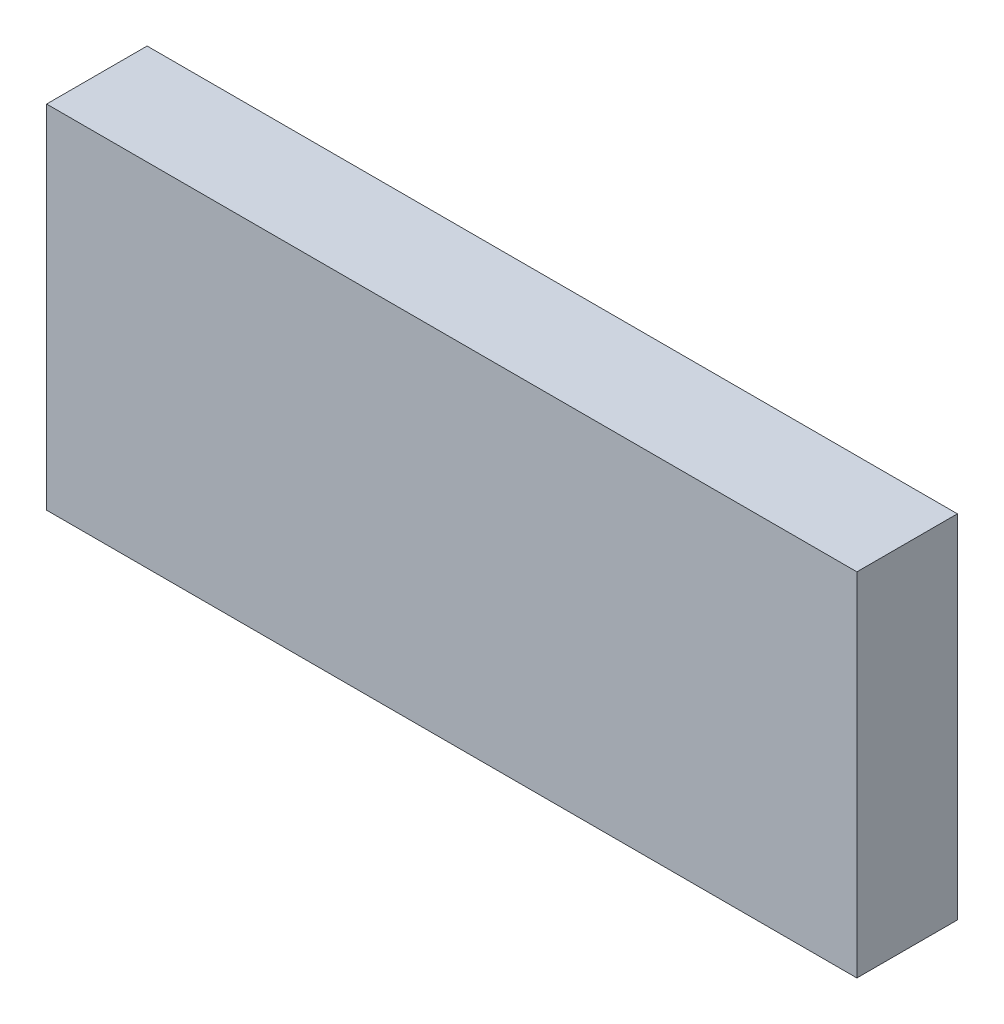
ISO-10303-21;
HEADER;
FILE_DESCRIPTION(('STEP AP214'),'2;1');
FILE_NAME('part.step','',(''),(''),'','','');
FILE_SCHEMA(('AUTOMOTIVE_DESIGN { 1 0 10303 214 1 1 1 1 }'));
ENDSEC;
DATA;
#1=APPLICATION_CONTEXT('core data for automotive mechanical design processes');
#2=APPLICATION_PROTOCOL_DEFINITION('international standard','automotive_design',2000,#1);
#3=PRODUCT_CONTEXT('',#1,'mechanical');
#4=PRODUCT('Part','Part','',(#3));
#5=PRODUCT_RELATED_PRODUCT_CATEGORY('part','',(#4));
#6=PRODUCT_DEFINITION_FORMATION('','',#4);
#7=PRODUCT_DEFINITION_CONTEXT('part definition',#1,'design');
#8=PRODUCT_DEFINITION('design','',#6,#7);
#9=PRODUCT_DEFINITION_SHAPE('','',#8);
#10=(LENGTH_UNIT() NAMED_UNIT(*) SI_UNIT(.MILLI.,.METRE.));
#11=(NAMED_UNIT(*) PLANE_ANGLE_UNIT() SI_UNIT($,.RADIAN.));
#12=(NAMED_UNIT(*) SI_UNIT($,.STERADIAN.) SOLID_ANGLE_UNIT());
#13=UNCERTAINTY_MEASURE_WITH_UNIT(LENGTH_MEASURE(1.E-05),#10,'distance_accuracy_value','');
#14=(GEOMETRIC_REPRESENTATION_CONTEXT(3) GLOBAL_UNCERTAINTY_ASSIGNED_CONTEXT((#13)) GLOBAL_UNIT_ASSIGNED_CONTEXT((#10,
#11,#12)) REPRESENTATION_CONTEXT('',''));
#15=CARTESIAN_POINT('',(0.,0.,0.));
#16=DIRECTION('',(0.,0.,1.));
#17=DIRECTION('',(1.,0.,0.));
#18=AXIS2_PLACEMENT_3D('',#15,#16,#17);
#19=CARTESIAN_POINT('',(409.575,-177.8,101.6));
#20=DIRECTION('',(-1.,0.,0.));
#21=DIRECTION('',(0.,0.,1.));
#22=AXIS2_PLACEMENT_3D('',#19,#20,#21);
#23=PLANE('',#22);
#24=DIRECTION('',(0.,1.,0.));
#25=VECTOR('',#24,1.);
#26=CARTESIAN_POINT('',(409.575,-177.8,0.));
#27=LINE('',#26,#25);
#28=CARTESIAN_POINT('',(409.575,-177.8,0.));
#29=VERTEX_POINT('',#28);
#30=CARTESIAN_POINT('',(409.575,177.8,0.));
#31=VERTEX_POINT('',#30);
#32=EDGE_CURVE('E106',#29,#31,#27,.T.);
#33=ORIENTED_EDGE('',*,*,#32,.T.);
#34=DIRECTION('',(0.,0.,-1.));
#35=VECTOR('',#34,1.);
#36=CARTESIAN_POINT('',(409.575,177.8,101.6));
#37=LINE('',#36,#35);
#38=CARTESIAN_POINT('',(409.575,177.8,101.6));
#39=VERTEX_POINT('',#38);
#40=EDGE_CURVE('E11',#39,#31,#37,.T.);
#41=ORIENTED_EDGE('',*,*,#40,.F.);
#42=DIRECTION('',(0.,1.,0.));
#43=VECTOR('',#42,1.);
#44=CARTESIAN_POINT('',(409.575,-177.8,101.6));
#45=LINE('',#44,#43);
#46=CARTESIAN_POINT('',(409.575,-177.8,101.6));
#47=VERTEX_POINT('',#46);
#48=EDGE_CURVE('E94',#47,#39,#45,.T.);
#49=ORIENTED_EDGE('',*,*,#48,.F.);
#50=DIRECTION('',(0.,0.,-1.));
#51=VECTOR('',#50,1.);
#52=CARTESIAN_POINT('',(409.575,-177.8,101.6));
#53=LINE('',#52,#51);
#54=EDGE_CURVE('E102',#47,#29,#53,.T.);
#55=ORIENTED_EDGE('',*,*,#54,.T.);
#56=EDGE_LOOP('',(#33,#41,#49,#55));
#57=FACE_BOUND('',#56,.T.);
#58=ADVANCED_FACE('F43',(#57),#23,.F.);
#59=CARTESIAN_POINT('',(-409.575,177.8,101.6));
#60=DIRECTION('',(0.,-1.,0.));
#61=DIRECTION('',(0.,0.,-1.));
#62=AXIS2_PLACEMENT_3D('',#59,#60,#61);
#63=PLANE('',#62);
#64=DIRECTION('',(-1.,0.,0.));
#65=VECTOR('',#64,1.);
#66=CARTESIAN_POINT('',(-409.575,177.8,0.));
#67=LINE('',#66,#65);
#68=CARTESIAN_POINT('',(-409.575,177.8,0.));
#69=VERTEX_POINT('',#68);
#70=EDGE_CURVE('E98',#31,#69,#67,.T.);
#71=ORIENTED_EDGE('',*,*,#70,.T.);
#72=DIRECTION('',(0.,0.,-1.));
#73=VECTOR('',#72,1.);
#74=CARTESIAN_POINT('',(-409.575,177.8,101.6));
#75=LINE('',#74,#73);
#76=CARTESIAN_POINT('',(-409.575,177.8,101.6));
#77=VERTEX_POINT('',#76);
#78=EDGE_CURVE('E51',#77,#69,#75,.T.);
#79=ORIENTED_EDGE('',*,*,#78,.F.);
#80=DIRECTION('',(-1.,0.,0.));
#81=VECTOR('',#80,1.);
#82=CARTESIAN_POINT('',(-409.575,177.8,101.6));
#83=LINE('',#82,#81);
#84=EDGE_CURVE('E89',#39,#77,#83,.T.);
#85=ORIENTED_EDGE('',*,*,#84,.F.);
#86=ORIENTED_EDGE('',*,*,#40,.T.);
#87=EDGE_LOOP('',(#71,#79,#85,#86));
#88=FACE_BOUND('',#87,.T.);
#89=ADVANCED_FACE('F97',(#88),#63,.F.);
#90=CARTESIAN_POINT('',(-409.575,-177.8,101.6));
#91=DIRECTION('',(1.,0.,0.));
#92=DIRECTION('',(0.,0.,-1.));
#93=AXIS2_PLACEMENT_3D('',#90,#91,#92);
#94=PLANE('',#93);
#95=DIRECTION('',(0.,-1.,0.));
#96=VECTOR('',#95,1.);
#97=CARTESIAN_POINT('',(-409.575,-177.8,0.));
#98=LINE('',#97,#96);
#99=CARTESIAN_POINT('',(-409.575,-177.8,0.));
#100=VERTEX_POINT('',#99);
#101=EDGE_CURVE('E76',#69,#100,#98,.T.);
#102=ORIENTED_EDGE('',*,*,#101,.T.);
#103=DIRECTION('',(0.,0.,-1.));
#104=VECTOR('',#103,1.);
#105=CARTESIAN_POINT('',(-409.575,-177.8,101.6));
#106=LINE('',#105,#104);
#107=CARTESIAN_POINT('',(-409.575,-177.8,101.6));
#108=VERTEX_POINT('',#107);
#109=EDGE_CURVE('E99',#108,#100,#106,.T.);
#110=ORIENTED_EDGE('',*,*,#109,.F.);
#111=DIRECTION('',(0.,-1.,0.));
#112=VECTOR('',#111,1.);
#113=CARTESIAN_POINT('',(-409.575,-177.8,101.6));
#114=LINE('',#113,#112);
#115=EDGE_CURVE('E92',#77,#108,#114,.T.);
#116=ORIENTED_EDGE('',*,*,#115,.F.);
#117=ORIENTED_EDGE('',*,*,#78,.T.);
#118=EDGE_LOOP('',(#102,#110,#116,#117));
#119=FACE_BOUND('',#118,.T.);
#120=ADVANCED_FACE('F100',(#119),#94,.F.);
#121=CARTESIAN_POINT('',(-409.575,-177.8,101.6));
#122=DIRECTION('',(0.,1.,0.));
#123=DIRECTION('',(0.,0.,1.));
#124=AXIS2_PLACEMENT_3D('',#121,#122,#123);
#125=PLANE('',#124);
#126=DIRECTION('',(1.,0.,0.));
#127=VECTOR('',#126,1.);
#128=CARTESIAN_POINT('',(-409.575,-177.8,0.));
#129=LINE('',#128,#127);
#130=EDGE_CURVE('E82',#100,#29,#129,.T.);
#131=ORIENTED_EDGE('',*,*,#130,.T.);
#132=ORIENTED_EDGE('',*,*,#54,.F.);
#133=DIRECTION('',(1.,0.,0.));
#134=VECTOR('',#133,1.);
#135=CARTESIAN_POINT('',(-409.575,-177.8,101.6));
#136=LINE('',#135,#134);
#137=EDGE_CURVE('E59',#108,#47,#136,.T.);
#138=ORIENTED_EDGE('',*,*,#137,.F.);
#139=ORIENTED_EDGE('',*,*,#109,.T.);
#140=EDGE_LOOP('',(#131,#132,#138,#139));
#141=FACE_BOUND('',#140,.T.);
#142=ADVANCED_FACE('F113',(#141),#125,.F.);
#143=CARTESIAN_POINT('',(0.,0.,101.6));
#144=DIRECTION('',(0.,0.,-1.));
#145=DIRECTION('',(-1.,0.,0.));
#146=AXIS2_PLACEMENT_3D('',#143,#144,#145);
#147=PLANE('',#146);
#148=ORIENTED_EDGE('',*,*,#48,.T.);
#149=ORIENTED_EDGE('',*,*,#84,.T.);
#150=ORIENTED_EDGE('',*,*,#115,.T.);
#151=ORIENTED_EDGE('',*,*,#137,.T.);
#152=EDGE_LOOP('',(#148,#149,#150,#151));
#153=FACE_BOUND('',#152,.T.);
#154=ADVANCED_FACE('F90',(#153),#147,.F.);
#155=CARTESIAN_POINT('',(0.,0.,0.));
#156=DIRECTION('',(0.,0.,-1.));
#157=DIRECTION('',(-1.,0.,0.));
#158=AXIS2_PLACEMENT_3D('',#155,#156,#157);
#159=PLANE('',#158);
#160=ORIENTED_EDGE('',*,*,#32,.F.);
#161=ORIENTED_EDGE('',*,*,#130,.F.);
#162=ORIENTED_EDGE('',*,*,#101,.F.);
#163=ORIENTED_EDGE('',*,*,#70,.F.);
#164=EDGE_LOOP('',(#160,#161,#162,#163));
#165=FACE_BOUND('',#164,.T.);
#166=ADVANCED_FACE('F116',(#165),#159,.T.);
#167=CLOSED_SHELL('',(#58,#89,#120,#142,#154,#166));
#168=MANIFOLD_SOLID_BREP('B2',#167);
#169=ADVANCED_BREP_SHAPE_REPRESENTATION('',(#18,#168),#14);
#170=SHAPE_DEFINITION_REPRESENTATION(#9,#169);
ENDSEC;
END-ISO-10303-21;
